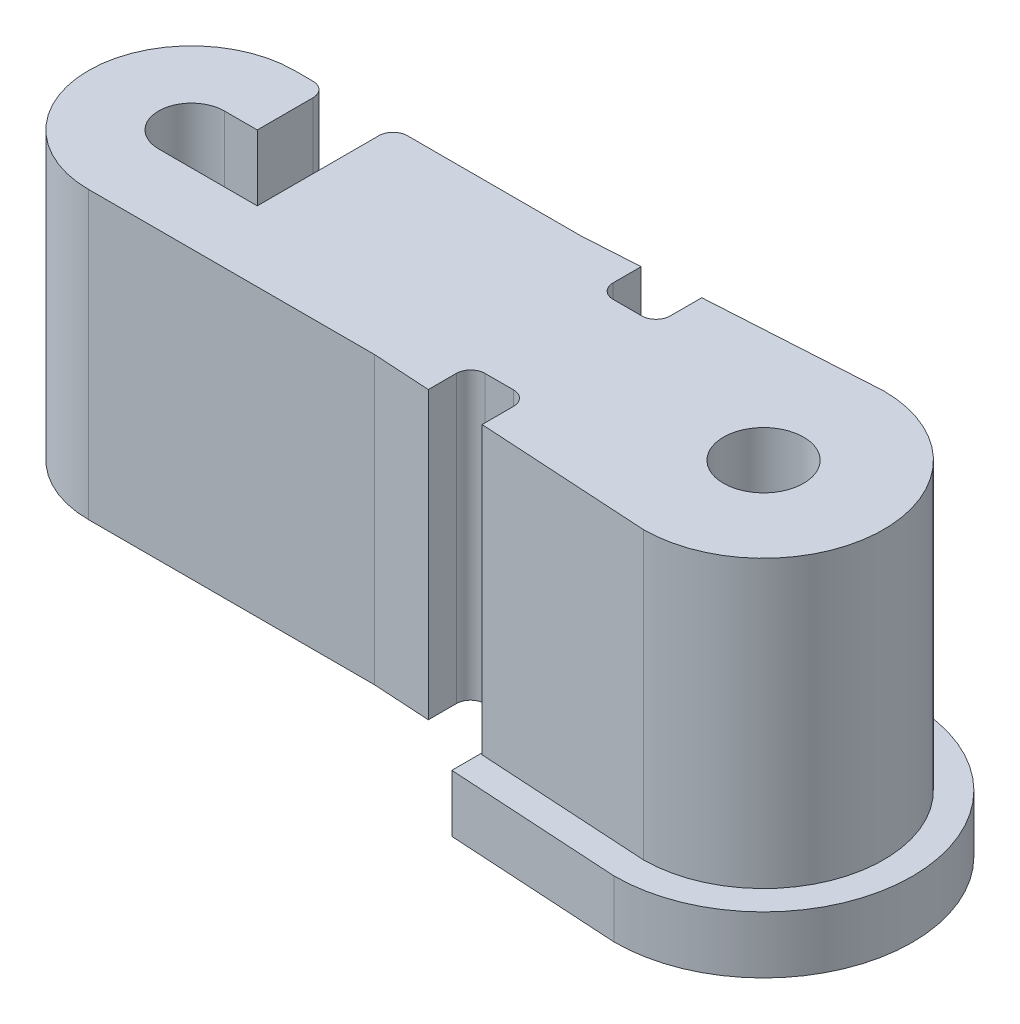
ISO-10303-21;
HEADER;
FILE_DESCRIPTION(('STEP AP214'),'2;1');
FILE_NAME('part.step','',(''),(''),'','','');
FILE_SCHEMA(('AUTOMOTIVE_DESIGN { 1 0 10303 214 1 1 1 1 }'));
ENDSEC;
DATA;
#1=APPLICATION_CONTEXT('core data for automotive mechanical design processes');
#2=APPLICATION_PROTOCOL_DEFINITION('international standard','automotive_design',2000,#1);
#3=PRODUCT_CONTEXT('',#1,'mechanical');
#4=PRODUCT('Part','Part','',(#3));
#5=PRODUCT_RELATED_PRODUCT_CATEGORY('part','',(#4));
#6=PRODUCT_DEFINITION_FORMATION('','',#4);
#7=PRODUCT_DEFINITION_CONTEXT('part definition',#1,'design');
#8=PRODUCT_DEFINITION('design','',#6,#7);
#9=PRODUCT_DEFINITION_SHAPE('','',#8);
#10=(LENGTH_UNIT() NAMED_UNIT(*) SI_UNIT(.MILLI.,.METRE.));
#11=(NAMED_UNIT(*) PLANE_ANGLE_UNIT() SI_UNIT($,.RADIAN.));
#12=(NAMED_UNIT(*) SI_UNIT($,.STERADIAN.) SOLID_ANGLE_UNIT());
#13=UNCERTAINTY_MEASURE_WITH_UNIT(LENGTH_MEASURE(1.E-05),#10,'distance_accuracy_value','');
#14=(GEOMETRIC_REPRESENTATION_CONTEXT(3) GLOBAL_UNCERTAINTY_ASSIGNED_CONTEXT((#13)) GLOBAL_UNIT_ASSIGNED_CONTEXT((#10,
#11,#12)) REPRESENTATION_CONTEXT('',''));
#15=CARTESIAN_POINT('',(0.,0.,0.));
#16=DIRECTION('',(0.,0.,1.));
#17=DIRECTION('',(1.,0.,0.));
#18=AXIS2_PLACEMENT_3D('',#15,#16,#17);
#19=CARTESIAN_POINT('',(0.,0.,0.));
#20=DIRECTION('',(0.,-1.,0.));
#21=DIRECTION('',(0.,0.,-1.));
#22=AXIS2_PLACEMENT_3D('',#19,#20,#21);
#23=PLANE('',#22);
#24=CARTESIAN_POINT('',(-1.625,0.,-0.685));
#25=DIRECTION('',(0.,-1.,0.));
#26=DIRECTION('',(0.,0.,-1.));
#27=AXIS2_PLACEMENT_3D('',#24,#25,#26);
#28=CIRCLE('',#27,0.125);
#29=CARTESIAN_POINT('',(-1.625,0.,-0.56));
#30=VERTEX_POINT('',#29);
#31=CARTESIAN_POINT('',(-1.51497307268199,0.,-0.625678205818127));
#32=VERTEX_POINT('',#31);
#33=EDGE_CURVE('E479',#30,#32,#28,.F.);
#34=ORIENTED_EDGE('',*,*,#33,.T.);
#35=DIRECTION('',(0.,0.,1.));
#36=VECTOR('',#35,1.);
#37=CARTESIAN_POINT('',(-1.51497307268199,0.,1.20955121136645));
#38=LINE('',#37,#36);
#39=CARTESIAN_POINT('',(-1.51497307268199,0.,0.625678205818127));
#40=VERTEX_POINT('',#39);
#41=EDGE_CURVE('E12',#32,#40,#38,.T.);
#42=ORIENTED_EDGE('',*,*,#41,.T.);
#43=CARTESIAN_POINT('',(-1.625,0.,0.685));
#44=DIRECTION('',(0.,-1.,0.));
#45=DIRECTION('',(0.,0.,-1.));
#46=AXIS2_PLACEMENT_3D('',#43,#44,#45);
#47=CIRCLE('',#46,0.125);
#48=CARTESIAN_POINT('',(-1.625,0.,0.56));
#49=VERTEX_POINT('',#48);
#50=EDGE_CURVE('E473',#40,#49,#47,.F.);
#51=ORIENTED_EDGE('',*,*,#50,.T.);
#52=DIRECTION('',(-1.,0.,0.));
#53=VECTOR('',#52,1.);
#54=CARTESIAN_POINT('',(-1.5,0.,0.56));
#55=LINE('',#54,#53);
#56=CARTESIAN_POINT('',(-1.875,0.,0.56));
#57=VERTEX_POINT('',#56);
#58=EDGE_CURVE('E390',#49,#57,#55,.T.);
#59=ORIENTED_EDGE('',*,*,#58,.T.);
#60=CARTESIAN_POINT('',(-1.875,0.,0.685));
#61=DIRECTION('',(0.,-1.,0.));
#62=DIRECTION('',(0.,0.,-1.));
#63=AXIS2_PLACEMENT_3D('',#60,#61,#62);
#64=CIRCLE('',#63,0.125);
#65=CARTESIAN_POINT('',(-2.,0.,0.685));
#66=VERTEX_POINT('',#65);
#67=EDGE_CURVE('E469',#57,#66,#64,.F.);
#68=ORIENTED_EDGE('',*,*,#67,.T.);
#69=DIRECTION('',(0.,0.,-1.));
#70=VECTOR('',#69,1.);
#71=CARTESIAN_POINT('',(-2.,0.,0.93));
#72=LINE('',#71,#70);
#73=CARTESIAN_POINT('',(-2.,0.,0.93));
#74=VERTEX_POINT('',#73);
#75=EDGE_CURVE('E393',#74,#66,#72,.T.);
#76=ORIENTED_EDGE('',*,*,#75,.F.);
#77=DIRECTION('',(0.998204845465779,0.,0.0598922907279451));
#78=VECTOR('',#77,1.);
#79=CARTESIAN_POINT('',(-2.50000000000002,0.,0.9));
#80=LINE('',#79,#78);
#81=CARTESIAN_POINT('',(-2.50000000000002,0.,0.9));
#82=VERTEX_POINT('',#81);
#83=EDGE_CURVE('E396',#82,#74,#80,.T.);
#84=ORIENTED_EDGE('',*,*,#83,.F.);
#85=DIRECTION('',(-1.,0.,0.));
#86=VECTOR('',#85,1.);
#87=CARTESIAN_POINT('',(-2.50000000000002,0.,0.9));
#88=LINE('',#87,#86);
#89=CARTESIAN_POINT('',(-5.,0.,0.9));
#90=VERTEX_POINT('',#89);
#91=EDGE_CURVE('E398',#82,#90,#88,.T.);
#92=ORIENTED_EDGE('',*,*,#91,.T.);
#93=CARTESIAN_POINT('',(-5.,0.,0.));
#94=DIRECTION('',(0.,1.,0.));
#95=DIRECTION('',(0.,0.,1.));
#96=AXIS2_PLACEMENT_3D('',#93,#94,#95);
#97=CIRCLE('',#96,0.9);
#98=CARTESIAN_POINT('',(-5.,0.,-0.9));
#99=VERTEX_POINT('',#98);
#100=EDGE_CURVE('E401',#99,#90,#97,.T.);
#101=ORIENTED_EDGE('',*,*,#100,.F.);
#102=DIRECTION('',(-1.,0.,0.));
#103=VECTOR('',#102,1.);
#104=CARTESIAN_POINT('',(-2.50000000000002,0.,-0.9));
#105=LINE('',#104,#103);
#106=CARTESIAN_POINT('',(-4.8375,0.,-0.9));
#107=VERTEX_POINT('',#106);
#108=EDGE_CURVE('E404',#107,#99,#105,.T.);
#109=ORIENTED_EDGE('',*,*,#108,.F.);
#110=CARTESIAN_POINT('',(-4.8375,0.,-0.775));
#111=DIRECTION('',(0.,-1.,0.));
#112=DIRECTION('',(0.,0.,-1.));
#113=AXIS2_PLACEMENT_3D('',#110,#111,#112);
#114=CIRCLE('',#113,0.125);
#115=CARTESIAN_POINT('',(-4.7125,0.,-0.775));
#116=VERTEX_POINT('',#115);
#117=EDGE_CURVE('E441',#107,#116,#114,.T.);
#118=ORIENTED_EDGE('',*,*,#117,.T.);
#119=DIRECTION('',(0.,0.,1.));
#120=VECTOR('',#119,1.);
#121=CARTESIAN_POINT('',(-4.7125,0.,0.));
#122=LINE('',#121,#120);
#123=CARTESIAN_POINT('',(-4.7125,0.,-0.2875));
#124=VERTEX_POINT('',#123);
#125=EDGE_CURVE('E298',#116,#124,#122,.T.);
#126=ORIENTED_EDGE('',*,*,#125,.T.);
#127=DIRECTION('',(1.,0.,0.));
#128=VECTOR('',#127,1.);
#129=CARTESIAN_POINT('',(0.,0.,-0.2875));
#130=LINE('',#129,#128);
#131=CARTESIAN_POINT('',(-5.,0.,-0.2875));
#132=VERTEX_POINT('',#131);
#133=EDGE_CURVE('E286',#132,#124,#130,.T.);
#134=ORIENTED_EDGE('',*,*,#133,.F.);
#135=CARTESIAN_POINT('',(-5.,0.,0.));
#136=DIRECTION('',(0.,1.,0.));
#137=DIRECTION('',(0.,0.,1.));
#138=AXIS2_PLACEMENT_3D('',#135,#136,#137);
#139=CIRCLE('',#138,0.2875);
#140=CARTESIAN_POINT('',(-5.,0.,0.2875));
#141=VERTEX_POINT('',#140);
#142=EDGE_CURVE('E289',#132,#141,#139,.T.);
#143=ORIENTED_EDGE('',*,*,#142,.T.);
#144=DIRECTION('',(-1.,0.,0.));
#145=VECTOR('',#144,1.);
#146=CARTESIAN_POINT('',(0.,0.,0.287499999999999));
#147=LINE('',#146,#145);
#148=CARTESIAN_POINT('',(-4.1375,0.,0.2875));
#149=VERTEX_POINT('',#148);
#150=EDGE_CURVE('E293',#149,#141,#147,.T.);
#151=ORIENTED_EDGE('',*,*,#150,.F.);
#152=DIRECTION('',(0.,0.,1.));
#153=VECTOR('',#152,1.);
#154=CARTESIAN_POINT('',(-4.1375,0.,0.));
#155=LINE('',#154,#153);
#156=CARTESIAN_POINT('',(-4.1375,0.,-0.775));
#157=VERTEX_POINT('',#156);
#158=EDGE_CURVE('E296',#157,#149,#155,.T.);
#159=ORIENTED_EDGE('',*,*,#158,.F.);
#160=CARTESIAN_POINT('',(-4.0125,0.,-0.775));
#161=DIRECTION('',(0.,-1.,0.));
#162=DIRECTION('',(0.,0.,-1.));
#163=AXIS2_PLACEMENT_3D('',#160,#161,#162);
#164=CIRCLE('',#163,0.125);
#165=CARTESIAN_POINT('',(-4.0125,0.,-0.9));
#166=VERTEX_POINT('',#165);
#167=EDGE_CURVE('E443',#157,#166,#164,.T.);
#168=ORIENTED_EDGE('',*,*,#167,.T.);
#169=CARTESIAN_POINT('',(-2.50000000000002,0.,-0.9));
#170=VERTEX_POINT('',#169);
#171=EDGE_CURVE('E332',#170,#166,#105,.T.);
#172=ORIENTED_EDGE('',*,*,#171,.F.);
#173=DIRECTION('',(0.998204845465779,0.,-0.0598922907279451));
#174=VECTOR('',#173,1.);
#175=CARTESIAN_POINT('',(-2.50000000000002,0.,-0.9));
#176=LINE('',#175,#174);
#177=CARTESIAN_POINT('',(-2.,0.,-0.93));
#178=VERTEX_POINT('',#177);
#179=EDGE_CURVE('E317',#170,#178,#176,.T.);
#180=ORIENTED_EDGE('',*,*,#179,.T.);
#181=DIRECTION('',(0.,0.,1.));
#182=VECTOR('',#181,1.);
#183=CARTESIAN_POINT('',(-2.,0.,-0.93));
#184=LINE('',#183,#182);
#185=CARTESIAN_POINT('',(-2.,0.,-0.685));
#186=VERTEX_POINT('',#185);
#187=EDGE_CURVE('E372',#178,#186,#184,.T.);
#188=ORIENTED_EDGE('',*,*,#187,.T.);
#189=CARTESIAN_POINT('',(-1.875,0.,-0.685));
#190=DIRECTION('',(0.,-1.,0.));
#191=DIRECTION('',(0.,0.,-1.));
#192=AXIS2_PLACEMENT_3D('',#189,#190,#191);
#193=CIRCLE('',#192,0.125);
#194=CARTESIAN_POINT('',(-1.875,0.,-0.56));
#195=VERTEX_POINT('',#194);
#196=EDGE_CURVE('E483',#186,#195,#193,.F.);
#197=ORIENTED_EDGE('',*,*,#196,.T.);
#198=DIRECTION('',(1.,0.,0.));
#199=VECTOR('',#198,1.);
#200=CARTESIAN_POINT('',(-2.,0.,-0.56));
#201=LINE('',#200,#199);
#202=EDGE_CURVE('E375',#195,#30,#201,.T.);
#203=ORIENTED_EDGE('',*,*,#202,.T.);
#204=EDGE_LOOP('',(#34,#42,#51,#59,#68,#76,#84,#92,#101,#109,#118,#126,#134,#143,#151,#159,#168,
#172,#180,#188,#197,#203));
#205=FACE_BOUND('',#204,.T.);
#206=ADVANCED_FACE('F36',(#205),#23,.T.);
#207=CARTESIAN_POINT('',(-2.50000000000002,2.5,-0.9));
#208=DIRECTION('',(0.,0.,1.));
#209=DIRECTION('',(1.,0.,0.));
#210=AXIS2_PLACEMENT_3D('',#207,#208,#209);
#211=PLANE('',#210);
#212=ORIENTED_EDGE('',*,*,#171,.T.);
#213=DIRECTION('',(0.,1.,0.));
#214=VECTOR('',#213,1.);
#215=CARTESIAN_POINT('',(-4.0125,2.5,-0.9));
#216=LINE('',#215,#214);
#217=CARTESIAN_POINT('',(-4.0125,2.5,-0.9));
#218=VERTEX_POINT('',#217);
#219=EDGE_CURVE('E409',#166,#218,#216,.T.);
#220=ORIENTED_EDGE('',*,*,#219,.T.);
#221=DIRECTION('',(-1.,0.,0.));
#222=VECTOR('',#221,1.);
#223=CARTESIAN_POINT('',(-2.50000000000002,2.5,-0.9));
#224=LINE('',#223,#222);
#225=CARTESIAN_POINT('',(-2.50000000000002,2.5,-0.9));
#226=VERTEX_POINT('',#225);
#227=EDGE_CURVE('E366',#226,#218,#224,.T.);
#228=ORIENTED_EDGE('',*,*,#227,.F.);
#229=DIRECTION('',(0.,-1.,0.));
#230=VECTOR('',#229,1.);
#231=CARTESIAN_POINT('',(-2.50000000000002,2.5,-0.9));
#232=LINE('',#231,#230);
#233=EDGE_CURVE('E407',#226,#170,#232,.T.);
#234=ORIENTED_EDGE('',*,*,#233,.T.);
#235=EDGE_LOOP('',(#212,#220,#228,#234));
#236=FACE_BOUND('',#235,.T.);
#237=ADVANCED_FACE('F597',(#236),#211,.F.);
#238=CARTESIAN_POINT('',(-2.50000000000002,2.5,-0.9));
#239=DIRECTION('',(-0.0598922907279451,0.,-0.998204845465779));
#240=DIRECTION('',(-0.998204845465779,0.,0.0598922907279451));
#241=AXIS2_PLACEMENT_3D('',#238,#239,#240);
#242=PLANE('',#241);
#243=ORIENTED_EDGE('',*,*,#179,.F.);
#244=ORIENTED_EDGE('',*,*,#233,.F.);
#245=DIRECTION('',(0.998204845465779,0.,-0.0598922907279451));
#246=VECTOR('',#245,1.);
#247=CARTESIAN_POINT('',(-2.50000000000002,2.5,-0.9));
#248=LINE('',#247,#246);
#249=CARTESIAN_POINT('',(-2.,2.5,-0.93));
#250=VERTEX_POINT('',#249);
#251=EDGE_CURVE('E328',#226,#250,#248,.T.);
#252=ORIENTED_EDGE('',*,*,#251,.T.);
#253=DIRECTION('',(0.,-1.,0.));
#254=VECTOR('',#253,1.);
#255=CARTESIAN_POINT('',(-2.,2.5,-0.93));
#256=LINE('',#255,#254);
#257=EDGE_CURVE('E369',#250,#178,#256,.T.);
#258=ORIENTED_EDGE('',*,*,#257,.T.);
#259=EDGE_LOOP('',(#243,#244,#252,#258));
#260=FACE_BOUND('',#259,.T.);
#261=ADVANCED_FACE('F600',(#260),#242,.T.);
#262=CARTESIAN_POINT('',(-4.8375,2.5,-0.9));
#263=VERTEX_POINT('',#262);
#264=CARTESIAN_POINT('',(-5.,2.5,-0.9));
#265=VERTEX_POINT('',#264);
#266=EDGE_CURVE('E365',#263,#265,#224,.T.);
#267=ORIENTED_EDGE('',*,*,#266,.F.);
#268=DIRECTION('',(0.,1.,0.));
#269=VECTOR('',#268,1.);
#270=CARTESIAN_POINT('',(-4.8375,2.5,-0.9));
#271=LINE('',#270,#269);
#272=EDGE_CURVE('E61',#263,#107,#271,.F.);
#273=ORIENTED_EDGE('',*,*,#272,.T.);
#274=ORIENTED_EDGE('',*,*,#108,.T.);
#275=DIRECTION('',(0.,-1.,0.));
#276=VECTOR('',#275,1.);
#277=CARTESIAN_POINT('',(-5.,2.5,-0.9));
#278=LINE('',#277,#276);
#279=EDGE_CURVE('E410',#265,#99,#278,.T.);
#280=ORIENTED_EDGE('',*,*,#279,.F.);
#281=EDGE_LOOP('',(#267,#273,#274,#280));
#282=FACE_BOUND('',#281,.T.);
#283=ADVANCED_FACE('F602',(#282),#211,.F.);
#284=CARTESIAN_POINT('',(-5.,2.5,0.));
#285=DIRECTION('',(0.,-1.,0.));
#286=DIRECTION('',(0.,0.,-1.));
#287=AXIS2_PLACEMENT_3D('',#284,#285,#286);
#288=CYLINDRICAL_SURFACE('',#287,0.9);
#289=ORIENTED_EDGE('',*,*,#100,.T.);
#290=DIRECTION('',(0.,-1.,0.));
#291=VECTOR('',#290,1.);
#292=CARTESIAN_POINT('',(-5.,2.5,0.9));
#293=LINE('',#292,#291);
#294=CARTESIAN_POINT('',(-5.,2.5,0.9));
#295=VERTEX_POINT('',#294);
#296=EDGE_CURVE('E413',#295,#90,#293,.T.);
#297=ORIENTED_EDGE('',*,*,#296,.F.);
#298=CARTESIAN_POINT('',(-5.,2.5,0.));
#299=DIRECTION('',(0.,1.,0.));
#300=DIRECTION('',(0.,0.,1.));
#301=AXIS2_PLACEMENT_3D('',#298,#299,#300);
#302=CIRCLE('',#301,0.9);
#303=EDGE_CURVE('E363',#265,#295,#302,.T.);
#304=ORIENTED_EDGE('',*,*,#303,.F.);
#305=ORIENTED_EDGE('',*,*,#279,.T.);
#306=EDGE_LOOP('',(#289,#297,#304,#305));
#307=FACE_BOUND('',#306,.T.);
#308=ADVANCED_FACE('F561',(#307),#288,.T.);
#309=CARTESIAN_POINT('',(-2.50000000000002,2.5,0.9));
#310=DIRECTION('',(0.,0.,1.));
#311=DIRECTION('',(1.,0.,0.));
#312=AXIS2_PLACEMENT_3D('',#309,#310,#311);
#313=PLANE('',#312);
#314=ORIENTED_EDGE('',*,*,#91,.F.);
#315=DIRECTION('',(0.,-1.,0.));
#316=VECTOR('',#315,1.);
#317=CARTESIAN_POINT('',(-2.50000000000002,2.5,0.9));
#318=LINE('',#317,#316);
#319=CARTESIAN_POINT('',(-2.50000000000002,2.5,0.9));
#320=VERTEX_POINT('',#319);
#321=EDGE_CURVE('E415',#320,#82,#318,.T.);
#322=ORIENTED_EDGE('',*,*,#321,.F.);
#323=DIRECTION('',(-1.,0.,0.));
#324=VECTOR('',#323,1.);
#325=CARTESIAN_POINT('',(-2.50000000000002,2.5,0.9));
#326=LINE('',#325,#324);
#327=EDGE_CURVE('E360',#320,#295,#326,.T.);
#328=ORIENTED_EDGE('',*,*,#327,.T.);
#329=ORIENTED_EDGE('',*,*,#296,.T.);
#330=EDGE_LOOP('',(#314,#322,#328,#329));
#331=FACE_BOUND('',#330,.T.);
#332=ADVANCED_FACE('F557',(#331),#313,.T.);
#333=CARTESIAN_POINT('',(-2.50000000000002,2.5,0.9));
#334=DIRECTION('',(0.0598922907279451,0.,-0.998204845465779));
#335=DIRECTION('',(-0.998204845465779,0.,-0.0598922907279451));
#336=AXIS2_PLACEMENT_3D('',#333,#334,#335);
#337=PLANE('',#336);
#338=ORIENTED_EDGE('',*,*,#83,.T.);
#339=DIRECTION('',(0.,-1.,0.));
#340=VECTOR('',#339,1.);
#341=CARTESIAN_POINT('',(-2.,2.5,0.93));
#342=LINE('',#341,#340);
#343=CARTESIAN_POINT('',(-2.,2.5,0.93));
#344=VERTEX_POINT('',#343);
#345=EDGE_CURVE('E417',#344,#74,#342,.T.);
#346=ORIENTED_EDGE('',*,*,#345,.F.);
#347=DIRECTION('',(0.998204845465779,0.,0.0598922907279451));
#348=VECTOR('',#347,1.);
#349=CARTESIAN_POINT('',(-2.50000000000002,2.5,0.9));
#350=LINE('',#349,#348);
#351=EDGE_CURVE('E358',#320,#344,#350,.T.);
#352=ORIENTED_EDGE('',*,*,#351,.F.);
#353=ORIENTED_EDGE('',*,*,#321,.T.);
#354=EDGE_LOOP('',(#338,#346,#352,#353));
#355=FACE_BOUND('',#354,.T.);
#356=ADVANCED_FACE('F552',(#355),#337,.F.);
#357=CARTESIAN_POINT('',(-2.,2.5,0.93));
#358=DIRECTION('',(-1.,0.,0.));
#359=DIRECTION('',(0.,0.,1.));
#360=AXIS2_PLACEMENT_3D('',#357,#358,#359);
#361=PLANE('',#360);
#362=ORIENTED_EDGE('',*,*,#75,.T.);
#363=DIRECTION('',(0.,-1.,0.));
#364=VECTOR('',#363,1.);
#365=CARTESIAN_POINT('',(-2.,2.5,0.685));
#366=LINE('',#365,#364);
#367=CARTESIAN_POINT('',(-2.,2.5,0.685));
#368=VERTEX_POINT('',#367);
#369=EDGE_CURVE('E454',#66,#368,#366,.F.);
#370=ORIENTED_EDGE('',*,*,#369,.T.);
#371=DIRECTION('',(0.,0.,-1.));
#372=VECTOR('',#371,1.);
#373=CARTESIAN_POINT('',(-2.,2.5,0.93));
#374=LINE('',#373,#372);
#375=EDGE_CURVE('E355',#344,#368,#374,.T.);
#376=ORIENTED_EDGE('',*,*,#375,.F.);
#377=ORIENTED_EDGE('',*,*,#345,.T.);
#378=EDGE_LOOP('',(#362,#370,#376,#377));
#379=FACE_BOUND('',#378,.T.);
#380=ADVANCED_FACE('F547',(#379),#361,.F.);
#381=CARTESIAN_POINT('',(-1.5,2.5,0.56));
#382=DIRECTION('',(0.,0.,1.));
#383=DIRECTION('',(1.,0.,0.));
#384=AXIS2_PLACEMENT_3D('',#381,#382,#383);
#385=PLANE('',#384);
#386=DIRECTION('',(-1.,0.,0.));
#387=VECTOR('',#386,1.);
#388=CARTESIAN_POINT('',(-1.5,2.5,0.56));
#389=LINE('',#388,#387);
#390=CARTESIAN_POINT('',(-1.625,2.5,0.56));
#391=VERTEX_POINT('',#390);
#392=CARTESIAN_POINT('',(-1.875,2.5,0.56));
#393=VERTEX_POINT('',#392);
#394=EDGE_CURVE('E352',#391,#393,#389,.T.);
#395=ORIENTED_EDGE('',*,*,#394,.T.);
#396=DIRECTION('',(0.,-1.,0.));
#397=VECTOR('',#396,1.);
#398=CARTESIAN_POINT('',(-1.875,2.5,0.56));
#399=LINE('',#398,#397);
#400=EDGE_CURVE('E451',#393,#57,#399,.T.);
#401=ORIENTED_EDGE('',*,*,#400,.T.);
#402=ORIENTED_EDGE('',*,*,#58,.F.);
#403=DIRECTION('',(0.,-1.,0.));
#404=VECTOR('',#403,1.);
#405=CARTESIAN_POINT('',(-1.625,2.5,0.56));
#406=LINE('',#405,#404);
#407=EDGE_CURVE('E449',#49,#391,#406,.F.);
#408=ORIENTED_EDGE('',*,*,#407,.T.);
#409=EDGE_LOOP('',(#395,#401,#402,#408));
#410=FACE_BOUND('',#409,.T.);
#411=ADVANCED_FACE('F537',(#410),#385,.T.);
#412=CARTESIAN_POINT('',(-1.5,2.5,0.56));
#413=DIRECTION('',(1.,0.,0.));
#414=DIRECTION('',(0.,0.,-1.));
#415=AXIS2_PLACEMENT_3D('',#412,#413,#414);
#416=PLANE('',#415);
#417=DIRECTION('',(0.,0.,1.));
#418=VECTOR('',#417,1.);
#419=CARTESIAN_POINT('',(-1.5,2.5,0.56));
#420=LINE('',#419,#418);
#421=CARTESIAN_POINT('',(-1.5,2.5,0.685));
#422=VERTEX_POINT('',#421);
#423=CARTESIAN_POINT('',(-1.5,2.5,0.96));
#424=VERTEX_POINT('',#423);
#425=EDGE_CURVE('E350',#422,#424,#420,.T.);
#426=ORIENTED_EDGE('',*,*,#425,.F.);
#427=DIRECTION('',(0.,-1.,0.));
#428=VECTOR('',#427,1.);
#429=CARTESIAN_POINT('',(-1.5,2.5,0.685));
#430=LINE('',#429,#428);
#431=CARTESIAN_POINT('',(-1.5,0.,0.685));
#432=VERTEX_POINT('',#431);
#433=EDGE_CURVE('E456',#422,#432,#430,.T.);
#434=ORIENTED_EDGE('',*,*,#433,.T.);
#435=DIRECTION('',(0.,0.,1.));
#436=VECTOR('',#435,1.);
#437=CARTESIAN_POINT('',(-1.5,0.,0.56));
#438=LINE('',#437,#436);
#439=CARTESIAN_POINT('',(-1.5,0.,0.96));
#440=VERTEX_POINT('',#439);
#441=EDGE_CURVE('E387',#432,#440,#438,.T.);
#442=ORIENTED_EDGE('',*,*,#441,.T.);
#443=DIRECTION('',(0.,-1.,0.));
#444=VECTOR('',#443,1.);
#445=CARTESIAN_POINT('',(-1.5,2.5,0.96));
#446=LINE('',#445,#444);
#447=EDGE_CURVE('E420',#424,#440,#446,.T.);
#448=ORIENTED_EDGE('',*,*,#447,.F.);
#449=EDGE_LOOP('',(#426,#434,#442,#448));
#450=FACE_BOUND('',#449,.T.);
#451=ADVANCED_FACE('F528',(#450),#416,.F.);
#452=CARTESIAN_POINT('',(0.,2.5,1.05));
#453=DIRECTION('',(-0.0598922907279466,0.,0.998204845465779));
#454=DIRECTION('',(0.998204845465779,0.,0.0598922907279466));
#455=AXIS2_PLACEMENT_3D('',#452,#453,#454);
#456=PLANE('',#455);
#457=DIRECTION('',(-0.998204845465779,0.,-0.0598922907279466));
#458=VECTOR('',#457,1.);
#459=CARTESIAN_POINT('',(0.,0.,1.05));
#460=LINE('',#459,#458);
#461=CARTESIAN_POINT('',(0.,0.,1.05));
#462=VERTEX_POINT('',#461);
#463=EDGE_CURVE('E385',#462,#440,#460,.T.);
#464=ORIENTED_EDGE('',*,*,#463,.F.);
#465=DIRECTION('',(0.,-1.,0.));
#466=VECTOR('',#465,1.);
#467=CARTESIAN_POINT('',(0.,2.5,1.05));
#468=LINE('',#467,#466);
#469=CARTESIAN_POINT('',(0.,2.5,1.05));
#470=VERTEX_POINT('',#469);
#471=EDGE_CURVE('E423',#470,#462,#468,.T.);
#472=ORIENTED_EDGE('',*,*,#471,.F.);
#473=DIRECTION('',(-0.998204845465779,0.,-0.0598922907279466));
#474=VECTOR('',#473,1.);
#475=CARTESIAN_POINT('',(0.,2.5,1.05));
#476=LINE('',#475,#474);
#477=EDGE_CURVE('E347',#470,#424,#476,.T.);
#478=ORIENTED_EDGE('',*,*,#477,.T.);
#479=ORIENTED_EDGE('',*,*,#447,.T.);
#480=EDGE_LOOP('',(#464,#472,#478,#479));
#481=FACE_BOUND('',#480,.T.);
#482=ADVANCED_FACE('F524',(#481),#456,.T.);
#483=CARTESIAN_POINT('',(0.,2.5,0.));
#484=DIRECTION('',(0.,-1.,0.));
#485=DIRECTION('',(0.,0.,-1.));
#486=AXIS2_PLACEMENT_3D('',#483,#484,#485);
#487=CYLINDRICAL_SURFACE('',#486,1.05);
#488=CARTESIAN_POINT('',(0.,0.,0.));
#489=DIRECTION('',(0.,-1.,0.));
#490=DIRECTION('',(0.,0.,-1.));
#491=AXIS2_PLACEMENT_3D('',#488,#489,#490);
#492=CIRCLE('',#491,1.05);
#493=CARTESIAN_POINT('',(0.,0.,-1.05));
#494=VERTEX_POINT('',#493);
#495=EDGE_CURVE('E383',#494,#462,#492,.T.);
#496=ORIENTED_EDGE('',*,*,#495,.F.);
#497=DIRECTION('',(0.,-1.,0.));
#498=VECTOR('',#497,1.);
#499=CARTESIAN_POINT('',(0.,2.5,-1.05));
#500=LINE('',#499,#498);
#501=CARTESIAN_POINT('',(0.,2.5,-1.05));
#502=VERTEX_POINT('',#501);
#503=EDGE_CURVE('E426',#502,#494,#500,.T.);
#504=ORIENTED_EDGE('',*,*,#503,.F.);
#505=CARTESIAN_POINT('',(0.,2.5,0.));
#506=DIRECTION('',(0.,-1.,0.));
#507=DIRECTION('',(0.,0.,-1.));
#508=AXIS2_PLACEMENT_3D('',#505,#506,#507);
#509=CIRCLE('',#508,1.05);
#510=EDGE_CURVE('E344',#502,#470,#509,.T.);
#511=ORIENTED_EDGE('',*,*,#510,.T.);
#512=ORIENTED_EDGE('',*,*,#471,.T.);
#513=EDGE_LOOP('',(#496,#504,#511,#512));
#514=FACE_BOUND('',#513,.T.);
#515=ADVANCED_FACE('F520',(#514),#487,.T.);
#516=CARTESIAN_POINT('',(-1.5,2.5,-0.96));
#517=DIRECTION('',(-0.0598922907279466,0.,-0.998204845465779));
#518=DIRECTION('',(-0.998204845465779,0.,0.0598922907279466));
#519=AXIS2_PLACEMENT_3D('',#516,#517,#518);
#520=PLANE('',#519);
#521=DIRECTION('',(0.998204845465779,0.,-0.0598922907279466));
#522=VECTOR('',#521,1.);
#523=CARTESIAN_POINT('',(-1.5,0.,-0.96));
#524=LINE('',#523,#522);
#525=CARTESIAN_POINT('',(-1.5,0.,-0.96));
#526=VERTEX_POINT('',#525);
#527=EDGE_CURVE('E381',#526,#494,#524,.T.);
#528=ORIENTED_EDGE('',*,*,#527,.F.);
#529=DIRECTION('',(0.,-1.,0.));
#530=VECTOR('',#529,1.);
#531=CARTESIAN_POINT('',(-1.5,2.5,-0.96));
#532=LINE('',#531,#530);
#533=CARTESIAN_POINT('',(-1.5,2.5,-0.96));
#534=VERTEX_POINT('',#533);
#535=EDGE_CURVE('E429',#534,#526,#532,.T.);
#536=ORIENTED_EDGE('',*,*,#535,.F.);
#537=DIRECTION('',(0.998204845465779,0.,-0.0598922907279466));
#538=VECTOR('',#537,1.);
#539=CARTESIAN_POINT('',(-1.5,2.5,-0.96));
#540=LINE('',#539,#538);
#541=EDGE_CURVE('E341',#534,#502,#540,.T.);
#542=ORIENTED_EDGE('',*,*,#541,.T.);
#543=ORIENTED_EDGE('',*,*,#503,.T.);
#544=EDGE_LOOP('',(#528,#536,#542,#543));
#545=FACE_BOUND('',#544,.T.);
#546=ADVANCED_FACE('F516',(#545),#520,.T.);
#547=CARTESIAN_POINT('',(-1.5,2.5,-0.96));
#548=DIRECTION('',(1.,0.,0.));
#549=DIRECTION('',(0.,0.,-1.));
#550=AXIS2_PLACEMENT_3D('',#547,#548,#549);
#551=PLANE('',#550);
#552=DIRECTION('',(0.,0.,1.));
#553=VECTOR('',#552,1.);
#554=CARTESIAN_POINT('',(-1.5,0.,-0.96));
#555=LINE('',#554,#553);
#556=CARTESIAN_POINT('',(-1.5,0.,-0.685));
#557=VERTEX_POINT('',#556);
#558=EDGE_CURVE('E378',#526,#557,#555,.T.);
#559=ORIENTED_EDGE('',*,*,#558,.T.);
#560=DIRECTION('',(0.,-1.,0.));
#561=VECTOR('',#560,1.);
#562=CARTESIAN_POINT('',(-1.5,2.5,-0.685));
#563=LINE('',#562,#561);
#564=CARTESIAN_POINT('',(-1.5,2.5,-0.685));
#565=VERTEX_POINT('',#564);
#566=EDGE_CURVE('E464',#557,#565,#563,.F.);
#567=ORIENTED_EDGE('',*,*,#566,.T.);
#568=DIRECTION('',(0.,0.,1.));
#569=VECTOR('',#568,1.);
#570=CARTESIAN_POINT('',(-1.5,2.5,-0.96));
#571=LINE('',#570,#569);
#572=EDGE_CURVE('E338',#534,#565,#571,.T.);
#573=ORIENTED_EDGE('',*,*,#572,.F.);
#574=ORIENTED_EDGE('',*,*,#535,.T.);
#575=EDGE_LOOP('',(#559,#567,#573,#574));
#576=FACE_BOUND('',#575,.T.);
#577=ADVANCED_FACE('F511',(#576),#551,.F.);
#578=CARTESIAN_POINT('',(-2.,2.5,-0.56));
#579=DIRECTION('',(0.,0.,-1.));
#580=DIRECTION('',(-1.,0.,0.));
#581=AXIS2_PLACEMENT_3D('',#578,#579,#580);
#582=PLANE('',#581);
#583=DIRECTION('',(1.,0.,0.));
#584=VECTOR('',#583,1.);
#585=CARTESIAN_POINT('',(-2.,2.5,-0.56));
#586=LINE('',#585,#584);
#587=CARTESIAN_POINT('',(-1.875,2.5,-0.56));
#588=VERTEX_POINT('',#587);
#589=CARTESIAN_POINT('',(-1.625,2.5,-0.56));
#590=VERTEX_POINT('',#589);
#591=EDGE_CURVE('E335',#588,#590,#586,.T.);
#592=ORIENTED_EDGE('',*,*,#591,.T.);
#593=DIRECTION('',(0.,-1.,0.));
#594=VECTOR('',#593,1.);
#595=CARTESIAN_POINT('',(-1.625,2.5,-0.56));
#596=LINE('',#595,#594);
#597=EDGE_CURVE('E461',#590,#30,#596,.T.);
#598=ORIENTED_EDGE('',*,*,#597,.T.);
#599=ORIENTED_EDGE('',*,*,#202,.F.);
#600=DIRECTION('',(0.,-1.,0.));
#601=VECTOR('',#600,1.);
#602=CARTESIAN_POINT('',(-1.875,2.5,-0.56));
#603=LINE('',#602,#601);
#604=EDGE_CURVE('E459',#195,#588,#603,.F.);
#605=ORIENTED_EDGE('',*,*,#604,.T.);
#606=EDGE_LOOP('',(#592,#598,#599,#605));
#607=FACE_BOUND('',#606,.T.);
#608=ADVANCED_FACE('F500',(#607),#582,.T.);
#609=CARTESIAN_POINT('',(-2.,2.5,-0.93));
#610=DIRECTION('',(1.,0.,0.));
#611=DIRECTION('',(0.,0.,-1.));
#612=AXIS2_PLACEMENT_3D('',#609,#610,#611);
#613=PLANE('',#612);
#614=DIRECTION('',(0.,0.,1.));
#615=VECTOR('',#614,1.);
#616=CARTESIAN_POINT('',(-2.,2.5,-0.93));
#617=LINE('',#616,#615);
#618=CARTESIAN_POINT('',(-2.,2.5,-0.685));
#619=VERTEX_POINT('',#618);
#620=EDGE_CURVE('E331',#250,#619,#617,.T.);
#621=ORIENTED_EDGE('',*,*,#620,.T.);
#622=DIRECTION('',(0.,-1.,0.));
#623=VECTOR('',#622,1.);
#624=CARTESIAN_POINT('',(-2.,0.,-0.685));
#625=LINE('',#624,#623);
#626=EDGE_CURVE('E466',#619,#186,#625,.T.);
#627=ORIENTED_EDGE('',*,*,#626,.T.);
#628=ORIENTED_EDGE('',*,*,#187,.F.);
#629=ORIENTED_EDGE('',*,*,#257,.F.);
#630=EDGE_LOOP('',(#621,#627,#628,#629));
#631=FACE_BOUND('',#630,.T.);
#632=ADVANCED_FACE('F497',(#631),#613,.T.);
#633=CARTESIAN_POINT('',(0.,2.5,0.));
#634=DIRECTION('',(0.,-1.,0.));
#635=DIRECTION('',(0.,0.,-1.));
#636=AXIS2_PLACEMENT_3D('',#633,#634,#635);
#637=PLANE('',#636);
#638=ORIENTED_EDGE('',*,*,#227,.T.);
#639=CARTESIAN_POINT('',(-4.0125,2.5,-0.775));
#640=DIRECTION('',(0.,-1.,0.));
#641=DIRECTION('',(0.,0.,-1.));
#642=AXIS2_PLACEMENT_3D('',#639,#640,#641);
#643=CIRCLE('',#642,0.125);
#644=CARTESIAN_POINT('',(-4.1375,2.5,-0.775));
#645=VERTEX_POINT('',#644);
#646=EDGE_CURVE('E437',#218,#645,#643,.F.);
#647=ORIENTED_EDGE('',*,*,#646,.T.);
#648=DIRECTION('',(0.,0.,1.));
#649=VECTOR('',#648,1.);
#650=CARTESIAN_POINT('',(-4.1375,2.5,0.));
#651=LINE('',#650,#649);
#652=CARTESIAN_POINT('',(-4.1375,2.5,0.2875));
#653=VERTEX_POINT('',#652);
#654=EDGE_CURVE('E311',#645,#653,#651,.T.);
#655=ORIENTED_EDGE('',*,*,#654,.T.);
#656=DIRECTION('',(-1.,0.,0.));
#657=VECTOR('',#656,1.);
#658=CARTESIAN_POINT('',(0.,2.5,0.287499999999999));
#659=LINE('',#658,#657);
#660=CARTESIAN_POINT('',(-5.,2.5,0.2875));
#661=VERTEX_POINT('',#660);
#662=EDGE_CURVE('E308',#653,#661,#659,.T.);
#663=ORIENTED_EDGE('',*,*,#662,.T.);
#664=CARTESIAN_POINT('',(-5.,2.5,0.));
#665=DIRECTION('',(0.,1.,0.));
#666=DIRECTION('',(0.,0.,1.));
#667=AXIS2_PLACEMENT_3D('',#664,#665,#666);
#668=CIRCLE('',#667,0.2875);
#669=CARTESIAN_POINT('',(-5.,2.5,-0.2875));
#670=VERTEX_POINT('',#669);
#671=EDGE_CURVE('E304',#670,#661,#668,.T.);
#672=ORIENTED_EDGE('',*,*,#671,.F.);
#673=DIRECTION('',(1.,0.,0.));
#674=VECTOR('',#673,1.);
#675=CARTESIAN_POINT('',(0.,2.5,-0.2875));
#676=LINE('',#675,#674);
#677=CARTESIAN_POINT('',(-4.7125,2.5,-0.2875));
#678=VERTEX_POINT('',#677);
#679=EDGE_CURVE('E301',#670,#678,#676,.T.);
#680=ORIENTED_EDGE('',*,*,#679,.T.);
#681=DIRECTION('',(0.,0.,1.));
#682=VECTOR('',#681,1.);
#683=CARTESIAN_POINT('',(-4.7125,2.5,0.));
#684=LINE('',#683,#682);
#685=CARTESIAN_POINT('',(-4.7125,2.5,-0.775));
#686=VERTEX_POINT('',#685);
#687=EDGE_CURVE('E290',#686,#678,#684,.T.);
#688=ORIENTED_EDGE('',*,*,#687,.F.);
#689=CARTESIAN_POINT('',(-4.8375,2.5,-0.775));
#690=DIRECTION('',(0.,-1.,0.));
#691=DIRECTION('',(0.,0.,-1.));
#692=AXIS2_PLACEMENT_3D('',#689,#690,#691);
#693=CIRCLE('',#692,0.125);
#694=EDGE_CURVE('E435',#686,#263,#693,.F.);
#695=ORIENTED_EDGE('',*,*,#694,.T.);
#696=ORIENTED_EDGE('',*,*,#266,.T.);
#697=ORIENTED_EDGE('',*,*,#303,.T.);
#698=ORIENTED_EDGE('',*,*,#327,.F.);
#699=ORIENTED_EDGE('',*,*,#351,.T.);
#700=ORIENTED_EDGE('',*,*,#375,.T.);
#701=CARTESIAN_POINT('',(-1.875,2.5,0.685));
#702=DIRECTION('',(0.,-1.,0.));
#703=DIRECTION('',(0.,0.,-1.));
#704=AXIS2_PLACEMENT_3D('',#701,#702,#703);
#705=CIRCLE('',#704,0.125);
#706=EDGE_CURVE('E471',#368,#393,#705,.T.);
#707=ORIENTED_EDGE('',*,*,#706,.T.);
#708=ORIENTED_EDGE('',*,*,#394,.F.);
#709=CARTESIAN_POINT('',(-1.625,2.5,0.685));
#710=DIRECTION('',(0.,-1.,0.));
#711=DIRECTION('',(0.,0.,-1.));
#712=AXIS2_PLACEMENT_3D('',#709,#710,#711);
#713=CIRCLE('',#712,0.125);
#714=EDGE_CURVE('E476',#391,#422,#713,.T.);
#715=ORIENTED_EDGE('',*,*,#714,.T.);
#716=ORIENTED_EDGE('',*,*,#425,.T.);
#717=ORIENTED_EDGE('',*,*,#477,.F.);
#718=ORIENTED_EDGE('',*,*,#510,.F.);
#719=ORIENTED_EDGE('',*,*,#541,.F.);
#720=ORIENTED_EDGE('',*,*,#572,.T.);
#721=CARTESIAN_POINT('',(-1.625,2.5,-0.685));
#722=DIRECTION('',(0.,-1.,0.));
#723=DIRECTION('',(0.,0.,-1.));
#724=AXIS2_PLACEMENT_3D('',#721,#722,#723);
#725=CIRCLE('',#724,0.125);
#726=EDGE_CURVE('E482',#565,#590,#725,.T.);
#727=ORIENTED_EDGE('',*,*,#726,.T.);
#728=ORIENTED_EDGE('',*,*,#591,.F.);
#729=CARTESIAN_POINT('',(-1.875,2.5,-0.685));
#730=DIRECTION('',(0.,-1.,0.));
#731=DIRECTION('',(0.,0.,-1.));
#732=AXIS2_PLACEMENT_3D('',#729,#730,#731);
#733=CIRCLE('',#732,0.125);
#734=EDGE_CURVE('E40',#588,#619,#733,.T.);
#735=ORIENTED_EDGE('',*,*,#734,.T.);
#736=ORIENTED_EDGE('',*,*,#620,.F.);
#737=ORIENTED_EDGE('',*,*,#251,.F.);
#738=EDGE_LOOP('',(#638,#647,#655,#663,#672,#680,#688,#695,#696,#697,#698,#699,#700,#707,#708,
#715,#716,#717,#718,#719,#720,#727,#728,#735,#736,#737));
#739=FACE_BOUND('',#738,.T.);
#740=CARTESIAN_POINT('',(0.,2.5,0.));
#741=DIRECTION('',(0.,1.,0.));
#742=DIRECTION('',(0.,0.,1.));
#743=AXIS2_PLACEMENT_3D('',#740,#741,#742);
#744=CIRCLE('',#743,0.35);
#745=CARTESIAN_POINT('',(0.,2.5,0.35));
#746=VERTEX_POINT('',#745);
#747=EDGE_CURVE('E282',#746,#746,#744,.T.);
#748=ORIENTED_EDGE('',*,*,#747,.F.);
#749=EDGE_LOOP('',(#748));
#750=FACE_BOUND('',#749,.T.);
#751=ADVANCED_FACE('F490',(#739,#750),#637,.F.);
#752=CARTESIAN_POINT('',(0.,0.,0.));
#753=DIRECTION('',(0.,1.,0.));
#754=DIRECTION('',(0.,0.,1.));
#755=AXIS2_PLACEMENT_3D('',#752,#753,#754);
#756=CYLINDRICAL_SURFACE('',#755,0.35);
#757=CARTESIAN_POINT('',(0.,0.,0.));
#758=DIRECTION('',(0.,1.,0.));
#759=DIRECTION('',(0.,0.,1.));
#760=AXIS2_PLACEMENT_3D('',#757,#758,#759);
#761=CIRCLE('',#760,0.35);
#762=CARTESIAN_POINT('',(0.,0.,0.35));
#763=VERTEX_POINT('',#762);
#764=EDGE_CURVE('E305',#763,#763,#761,.T.);
#765=ORIENTED_EDGE('',*,*,#764,.F.);
#766=EDGE_LOOP('',(#765));
#767=FACE_BOUND('',#766,.T.);
#768=ORIENTED_EDGE('',*,*,#747,.T.);
#769=EDGE_LOOP('',(#768));
#770=FACE_BOUND('',#769,.T.);
#771=ADVANCED_FACE('F643',(#767,#770),#756,.F.);
#772=CARTESIAN_POINT('',(0.,0.,-0.2875));
#773=DIRECTION('',(0.,0.,1.));
#774=DIRECTION('',(1.,0.,0.));
#775=AXIS2_PLACEMENT_3D('',#772,#773,#774);
#776=PLANE('',#775);
#777=ORIENTED_EDGE('',*,*,#679,.F.);
#778=DIRECTION('',(0.,1.,0.));
#779=VECTOR('',#778,1.);
#780=CARTESIAN_POINT('',(-5.,0.,-0.2875));
#781=LINE('',#780,#779);
#782=EDGE_CURVE('E300',#132,#670,#781,.T.);
#783=ORIENTED_EDGE('',*,*,#782,.F.);
#784=ORIENTED_EDGE('',*,*,#133,.T.);
#785=DIRECTION('',(0.,1.,0.));
#786=VECTOR('',#785,1.);
#787=CARTESIAN_POINT('',(-4.7125,0.,-0.2875));
#788=LINE('',#787,#786);
#789=EDGE_CURVE('E314',#124,#678,#788,.T.);
#790=ORIENTED_EDGE('',*,*,#789,.T.);
#791=EDGE_LOOP('',(#777,#783,#784,#790));
#792=FACE_BOUND('',#791,.T.);
#793=ADVANCED_FACE('F575',(#792),#776,.T.);
#794=CARTESIAN_POINT('',(-4.7125,0.,0.));
#795=DIRECTION('',(-1.,0.,0.));
#796=DIRECTION('',(0.,0.,1.));
#797=AXIS2_PLACEMENT_3D('',#794,#795,#796);
#798=PLANE('',#797);
#799=ORIENTED_EDGE('',*,*,#125,.F.);
#800=DIRECTION('',(0.,1.,0.));
#801=VECTOR('',#800,1.);
#802=CARTESIAN_POINT('',(-4.7125,0.,-0.775));
#803=LINE('',#802,#801);
#804=EDGE_CURVE('E445',#116,#686,#803,.T.);
#805=ORIENTED_EDGE('',*,*,#804,.T.);
#806=ORIENTED_EDGE('',*,*,#687,.T.);
#807=ORIENTED_EDGE('',*,*,#789,.F.);
#808=EDGE_LOOP('',(#799,#805,#806,#807));
#809=FACE_BOUND('',#808,.T.);
#810=ADVANCED_FACE('F570',(#809),#798,.F.);
#811=CARTESIAN_POINT('',(-4.1375,0.,0.));
#812=DIRECTION('',(-1.,0.,0.));
#813=DIRECTION('',(0.,0.,1.));
#814=AXIS2_PLACEMENT_3D('',#811,#812,#813);
#815=PLANE('',#814);
#816=ORIENTED_EDGE('',*,*,#654,.F.);
#817=DIRECTION('',(0.,1.,0.));
#818=VECTOR('',#817,1.);
#819=CARTESIAN_POINT('',(-4.1375,0.,-0.775));
#820=LINE('',#819,#818);
#821=EDGE_CURVE('E439',#645,#157,#820,.F.);
#822=ORIENTED_EDGE('',*,*,#821,.T.);
#823=ORIENTED_EDGE('',*,*,#158,.T.);
#824=DIRECTION('',(0.,1.,0.));
#825=VECTOR('',#824,1.);
#826=CARTESIAN_POINT('',(-4.1375,0.,0.2875));
#827=LINE('',#826,#825);
#828=EDGE_CURVE('E318',#149,#653,#827,.T.);
#829=ORIENTED_EDGE('',*,*,#828,.T.);
#830=EDGE_LOOP('',(#816,#822,#823,#829));
#831=FACE_BOUND('',#830,.T.);
#832=ADVANCED_FACE('F588',(#831),#815,.T.);
#833=CARTESIAN_POINT('',(0.,0.,0.287499999999999));
#834=DIRECTION('',(0.,0.,-1.));
#835=DIRECTION('',(-1.,0.,0.));
#836=AXIS2_PLACEMENT_3D('',#833,#834,#835);
#837=PLANE('',#836);
#838=ORIENTED_EDGE('',*,*,#662,.F.);
#839=ORIENTED_EDGE('',*,*,#828,.F.);
#840=ORIENTED_EDGE('',*,*,#150,.T.);
#841=DIRECTION('',(0.,1.,0.));
#842=VECTOR('',#841,1.);
#843=CARTESIAN_POINT('',(-5.,0.,0.2875));
#844=LINE('',#843,#842);
#845=EDGE_CURVE('E321',#141,#661,#844,.T.);
#846=ORIENTED_EDGE('',*,*,#845,.T.);
#847=EDGE_LOOP('',(#838,#839,#840,#846));
#848=FACE_BOUND('',#847,.T.);
#849=ADVANCED_FACE('F585',(#848),#837,.T.);
#850=CARTESIAN_POINT('',(-5.,0.,0.));
#851=DIRECTION('',(0.,1.,0.));
#852=DIRECTION('',(0.,0.,1.));
#853=AXIS2_PLACEMENT_3D('',#850,#851,#852);
#854=CYLINDRICAL_SURFACE('',#853,0.2875);
#855=ORIENTED_EDGE('',*,*,#671,.T.);
#856=ORIENTED_EDGE('',*,*,#845,.F.);
#857=ORIENTED_EDGE('',*,*,#142,.F.);
#858=ORIENTED_EDGE('',*,*,#782,.T.);
#859=EDGE_LOOP('',(#855,#856,#857,#858));
#860=FACE_BOUND('',#859,.T.);
#861=ADVANCED_FACE('F581',(#860),#854,.F.);
#862=CARTESIAN_POINT('',(-4.0125,2.5,-0.775));
#863=DIRECTION('',(0.,-1.,0.));
#864=DIRECTION('',(0.,0.,-1.));
#865=AXIS2_PLACEMENT_3D('',#862,#863,#864);
#866=CYLINDRICAL_SURFACE('',#865,0.125);
#867=ORIENTED_EDGE('',*,*,#167,.F.);
#868=ORIENTED_EDGE('',*,*,#821,.F.);
#869=ORIENTED_EDGE('',*,*,#646,.F.);
#870=ORIENTED_EDGE('',*,*,#219,.F.);
#871=EDGE_LOOP('',(#867,#868,#869,#870));
#872=FACE_BOUND('',#871,.T.);
#873=ADVANCED_FACE('F594',(#872),#866,.T.);
#874=CARTESIAN_POINT('',(-4.8375,0.,-0.775));
#875=DIRECTION('',(0.,1.,0.));
#876=DIRECTION('',(0.,0.,1.));
#877=AXIS2_PLACEMENT_3D('',#874,#875,#876);
#878=CYLINDRICAL_SURFACE('',#877,0.125);
#879=ORIENTED_EDGE('',*,*,#117,.F.);
#880=ORIENTED_EDGE('',*,*,#272,.F.);
#881=ORIENTED_EDGE('',*,*,#694,.F.);
#882=ORIENTED_EDGE('',*,*,#804,.F.);
#883=EDGE_LOOP('',(#879,#880,#881,#882));
#884=FACE_BOUND('',#883,.T.);
#885=ADVANCED_FACE('F567',(#884),#878,.T.);
#886=CARTESIAN_POINT('',(-1.875,2.5,0.685));
#887=DIRECTION('',(0.,-1.,0.));
#888=DIRECTION('',(0.,0.,-1.));
#889=AXIS2_PLACEMENT_3D('',#886,#887,#888);
#890=CYLINDRICAL_SURFACE('',#889,0.125);
#891=ORIENTED_EDGE('',*,*,#706,.F.);
#892=ORIENTED_EDGE('',*,*,#369,.F.);
#893=ORIENTED_EDGE('',*,*,#67,.F.);
#894=ORIENTED_EDGE('',*,*,#400,.F.);
#895=EDGE_LOOP('',(#891,#892,#893,#894));
#896=FACE_BOUND('',#895,.T.);
#897=ADVANCED_FACE('F542',(#896),#890,.F.);
#898=CARTESIAN_POINT('',(-1.625,2.5,0.685));
#899=DIRECTION('',(0.,-1.,0.));
#900=DIRECTION('',(0.,0.,-1.));
#901=AXIS2_PLACEMENT_3D('',#898,#899,#900);
#902=CYLINDRICAL_SURFACE('',#901,0.125);
#903=ORIENTED_EDGE('',*,*,#714,.F.);
#904=ORIENTED_EDGE('',*,*,#407,.F.);
#905=ORIENTED_EDGE('',*,*,#50,.F.);
#906=EDGE_CURVE('E474',#432,#40,#47,.F.);
#907=ORIENTED_EDGE('',*,*,#906,.F.);
#908=ORIENTED_EDGE('',*,*,#433,.F.);
#909=EDGE_LOOP('',(#903,#904,#905,#907,#908));
#910=FACE_BOUND('',#909,.T.);
#911=ADVANCED_FACE('F533',(#910),#902,.F.);
#912=CARTESIAN_POINT('',(-1.625,2.5,-0.685));
#913=DIRECTION('',(0.,-1.,0.));
#914=DIRECTION('',(0.,0.,-1.));
#915=AXIS2_PLACEMENT_3D('',#912,#913,#914);
#916=CYLINDRICAL_SURFACE('',#915,0.125);
#917=ORIENTED_EDGE('',*,*,#726,.F.);
#918=ORIENTED_EDGE('',*,*,#566,.F.);
#919=EDGE_CURVE('E478',#32,#557,#28,.F.);
#920=ORIENTED_EDGE('',*,*,#919,.F.);
#921=ORIENTED_EDGE('',*,*,#33,.F.);
#922=ORIENTED_EDGE('',*,*,#597,.F.);
#923=EDGE_LOOP('',(#917,#918,#920,#921,#922));
#924=FACE_BOUND('',#923,.T.);
#925=ADVANCED_FACE('F506',(#924),#916,.F.);
#926=CARTESIAN_POINT('',(-1.875,2.5,-0.685));
#927=DIRECTION('',(0.,1.,0.));
#928=DIRECTION('',(0.,0.,1.));
#929=AXIS2_PLACEMENT_3D('',#926,#927,#928);
#930=CYLINDRICAL_SURFACE('',#929,0.125);
#931=ORIENTED_EDGE('',*,*,#734,.F.);
#932=ORIENTED_EDGE('',*,*,#604,.F.);
#933=ORIENTED_EDGE('',*,*,#196,.F.);
#934=ORIENTED_EDGE('',*,*,#626,.F.);
#935=EDGE_LOOP('',(#931,#932,#933,#934));
#936=FACE_BOUND('',#935,.T.);
#937=ADVANCED_FACE('F38',(#936),#930,.F.);
#938=CARTESIAN_POINT('',(0.,0.,0.));
#939=DIRECTION('',(0.,1.,0.));
#940=DIRECTION('',(0.,0.,1.));
#941=AXIS2_PLACEMENT_3D('',#938,#939,#940);
#942=PLANE('',#941);
#943=CARTESIAN_POINT('',(-1.51497307268199,0.,-1.20955121136645));
#944=VERTEX_POINT('',#943);
#945=EDGE_CURVE('E46',#944,#32,#38,.T.);
#946=ORIENTED_EDGE('',*,*,#945,.T.);
#947=ORIENTED_EDGE('',*,*,#919,.T.);
#948=ORIENTED_EDGE('',*,*,#558,.F.);
#949=ORIENTED_EDGE('',*,*,#527,.T.);
#950=ORIENTED_EDGE('',*,*,#495,.T.);
#951=ORIENTED_EDGE('',*,*,#463,.T.);
#952=ORIENTED_EDGE('',*,*,#441,.F.);
#953=ORIENTED_EDGE('',*,*,#906,.T.);
#954=CARTESIAN_POINT('',(-1.51497307268199,0.,1.20955121136645));
#955=VERTEX_POINT('',#954);
#956=EDGE_CURVE('E47',#40,#955,#38,.T.);
#957=ORIENTED_EDGE('',*,*,#956,.T.);
#958=DIRECTION('',(0.998204845465779,0.,0.0598922907279465));
#959=VECTOR('',#958,1.);
#960=CARTESIAN_POINT('',(-0.00789257860382672,0.,1.29997604101113));
#961=LINE('',#960,#959);
#962=CARTESIAN_POINT('',(-0.00789257860382672,0.,1.29997604101113));
#963=VERTEX_POINT('',#962);
#964=EDGE_CURVE('E268',#955,#963,#961,.T.);
#965=ORIENTED_EDGE('',*,*,#964,.T.);
#966=CARTESIAN_POINT('',(0.,0.,0.));
#967=DIRECTION('',(0.,1.,0.));
#968=DIRECTION('',(0.,0.,1.));
#969=AXIS2_PLACEMENT_3D('',#966,#967,#968);
#970=CIRCLE('',#969,1.3);
#971=CARTESIAN_POINT('',(-0.00789257860382559,0.,-1.29997604101113));
#972=VERTEX_POINT('',#971);
#973=EDGE_CURVE('E265',#963,#972,#970,.T.);
#974=ORIENTED_EDGE('',*,*,#973,.T.);
#975=DIRECTION('',(-0.998204845465779,0.,0.0598922907279467));
#976=VECTOR('',#975,1.);
#977=CARTESIAN_POINT('',(-1.51497307268199,0.,-1.20955121136645));
#978=LINE('',#977,#976);
#979=EDGE_CURVE('E276',#972,#944,#978,.T.);
#980=ORIENTED_EDGE('',*,*,#979,.T.);
#981=EDGE_LOOP('',(#946,#947,#948,#949,#950,#951,#952,#953,#957,#965,#974,#980));
#982=FACE_BOUND('',#981,.T.);
#983=ADVANCED_FACE('F509',(#982),#942,.T.);
#984=CARTESIAN_POINT('',(-1.51497307268199,-0.5,-1.20955121136645));
#985=DIRECTION('',(-0.0598922907279467,0.,-0.998204845465779));
#986=DIRECTION('',(-0.998204845465779,0.,0.0598922907279467));
#987=AXIS2_PLACEMENT_3D('',#984,#985,#986);
#988=PLANE('',#987);
#989=ORIENTED_EDGE('',*,*,#979,.F.);
#990=DIRECTION('',(0.,1.,0.));
#991=VECTOR('',#990,1.);
#992=CARTESIAN_POINT('',(-0.00789257860382559,-0.5,-1.29997604101113));
#993=LINE('',#992,#991);
#994=CARTESIAN_POINT('',(-0.00789257860382559,-0.5,-1.29997604101113));
#995=VERTEX_POINT('',#994);
#996=EDGE_CURVE('E264',#995,#972,#993,.T.);
#997=ORIENTED_EDGE('',*,*,#996,.F.);
#998=DIRECTION('',(-0.998204845465779,0.,0.0598922907279467));
#999=VECTOR('',#998,1.);
#1000=CARTESIAN_POINT('',(-1.51497307268199,-0.5,-1.20955121136645));
#1001=LINE('',#1000,#999);
#1002=CARTESIAN_POINT('',(-1.51497307268199,-0.5,-1.20955121136645));
#1003=VERTEX_POINT('',#1002);
#1004=EDGE_CURVE('E258',#995,#1003,#1001,.T.);
#1005=ORIENTED_EDGE('',*,*,#1004,.T.);
#1006=DIRECTION('',(0.,1.,0.));
#1007=VECTOR('',#1006,1.);
#1008=CARTESIAN_POINT('',(-1.51497307268199,-0.5,-1.20955121136645));
#1009=LINE('',#1008,#1007);
#1010=EDGE_CURVE('E241',#1003,#944,#1009,.T.);
#1011=ORIENTED_EDGE('',*,*,#1010,.T.);
#1012=EDGE_LOOP('',(#989,#997,#1005,#1011));
#1013=FACE_BOUND('',#1012,.T.);
#1014=ADVANCED_FACE('F263',(#1013),#988,.T.);
#1015=CARTESIAN_POINT('',(0.,-0.5,0.));
#1016=DIRECTION('',(0.,1.,0.));
#1017=DIRECTION('',(0.,0.,1.));
#1018=AXIS2_PLACEMENT_3D('',#1015,#1016,#1017);
#1019=CYLINDRICAL_SURFACE('',#1018,1.3);
#1020=ORIENTED_EDGE('',*,*,#973,.F.);
#1021=DIRECTION('',(0.,1.,0.));
#1022=VECTOR('',#1021,1.);
#1023=CARTESIAN_POINT('',(-0.00789257860382672,-0.5,1.29997604101113));
#1024=LINE('',#1023,#1022);
#1025=CARTESIAN_POINT('',(-0.00789257860382672,-0.5,1.29997604101113));
#1026=VERTEX_POINT('',#1025);
#1027=EDGE_CURVE('E283',#1026,#963,#1024,.T.);
#1028=ORIENTED_EDGE('',*,*,#1027,.F.);
#1029=CARTESIAN_POINT('',(0.,-0.5,0.));
#1030=DIRECTION('',(0.,1.,0.));
#1031=DIRECTION('',(0.,0.,1.));
#1032=AXIS2_PLACEMENT_3D('',#1029,#1030,#1031);
#1033=CIRCLE('',#1032,1.3);
#1034=EDGE_CURVE('E251',#1026,#995,#1033,.T.);
#1035=ORIENTED_EDGE('',*,*,#1034,.T.);
#1036=ORIENTED_EDGE('',*,*,#996,.T.);
#1037=EDGE_LOOP('',(#1020,#1028,#1035,#1036));
#1038=FACE_BOUND('',#1037,.T.);
#1039=ADVANCED_FACE('F665',(#1038),#1019,.T.);
#1040=CARTESIAN_POINT('',(-0.00789257860382672,-0.5,1.29997604101113));
#1041=DIRECTION('',(-0.0598922907279465,0.,0.998204845465779));
#1042=DIRECTION('',(0.998204845465779,0.,0.0598922907279465));
#1043=AXIS2_PLACEMENT_3D('',#1040,#1041,#1042);
#1044=PLANE('',#1043);
#1045=ORIENTED_EDGE('',*,*,#964,.F.);
#1046=DIRECTION('',(0.,1.,0.));
#1047=VECTOR('',#1046,1.);
#1048=CARTESIAN_POINT('',(-1.51497307268199,-0.5,1.20955121136645));
#1049=LINE('',#1048,#1047);
#1050=CARTESIAN_POINT('',(-1.51497307268199,-0.5,1.20955121136645));
#1051=VERTEX_POINT('',#1050);
#1052=EDGE_CURVE('E250',#1051,#955,#1049,.T.);
#1053=ORIENTED_EDGE('',*,*,#1052,.F.);
#1054=DIRECTION('',(0.998204845465779,0.,0.0598922907279465));
#1055=VECTOR('',#1054,1.);
#1056=CARTESIAN_POINT('',(-0.00789257860382672,-0.5,1.29997604101113));
#1057=LINE('',#1056,#1055);
#1058=EDGE_CURVE('E261',#1051,#1026,#1057,.T.);
#1059=ORIENTED_EDGE('',*,*,#1058,.T.);
#1060=ORIENTED_EDGE('',*,*,#1027,.T.);
#1061=EDGE_LOOP('',(#1045,#1053,#1059,#1060));
#1062=FACE_BOUND('',#1061,.T.);
#1063=ADVANCED_FACE('F668',(#1062),#1044,.T.);
#1064=CARTESIAN_POINT('',(-1.51497307268199,-0.5,1.20955121136645));
#1065=DIRECTION('',(-1.,0.,0.));
#1066=DIRECTION('',(0.,0.,1.));
#1067=AXIS2_PLACEMENT_3D('',#1064,#1065,#1066);
#1068=PLANE('',#1067);
#1069=ORIENTED_EDGE('',*,*,#945,.F.);
#1070=ORIENTED_EDGE('',*,*,#1010,.F.);
#1071=DIRECTION('',(0.,0.,1.));
#1072=VECTOR('',#1071,1.);
#1073=CARTESIAN_POINT('',(-1.51497307268199,-0.5,1.20955121136645));
#1074=LINE('',#1073,#1072);
#1075=EDGE_CURVE('E244',#1003,#1051,#1074,.T.);
#1076=ORIENTED_EDGE('',*,*,#1075,.T.);
#1077=ORIENTED_EDGE('',*,*,#1052,.T.);
#1078=ORIENTED_EDGE('',*,*,#956,.F.);
#1079=ORIENTED_EDGE('',*,*,#41,.F.);
#1080=EDGE_LOOP('',(#1069,#1070,#1076,#1077,#1078,#1079));
#1081=FACE_BOUND('',#1080,.T.);
#1082=ADVANCED_FACE('F243',(#1081),#1068,.T.);
#1083=CARTESIAN_POINT('',(0.,-0.5,0.));
#1084=DIRECTION('',(0.,1.,0.));
#1085=DIRECTION('',(0.,0.,1.));
#1086=AXIS2_PLACEMENT_3D('',#1083,#1084,#1085);
#1087=PLANE('',#1086);
#1088=CARTESIAN_POINT('',(0.,-0.5,0.));
#1089=DIRECTION('',(0.,1.,0.));
#1090=DIRECTION('',(0.,0.,1.));
#1091=AXIS2_PLACEMENT_3D('',#1088,#1089,#1090);
#1092=CIRCLE('',#1091,0.125);
#1093=CARTESIAN_POINT('',(0.,-0.5,0.125));
#1094=VERTEX_POINT('',#1093);
#1095=EDGE_CURVE('E277',#1094,#1094,#1092,.T.);
#1096=ORIENTED_EDGE('',*,*,#1095,.T.);
#1097=EDGE_LOOP('',(#1096));
#1098=FACE_BOUND('',#1097,.T.);
#1099=ORIENTED_EDGE('',*,*,#1004,.F.);
#1100=ORIENTED_EDGE('',*,*,#1034,.F.);
#1101=ORIENTED_EDGE('',*,*,#1058,.F.);
#1102=ORIENTED_EDGE('',*,*,#1075,.F.);
#1103=EDGE_LOOP('',(#1099,#1100,#1101,#1102));
#1104=FACE_BOUND('',#1103,.T.);
#1105=ADVANCED_FACE('F256',(#1098,#1104),#1087,.F.);
#1106=ORIENTED_EDGE('',*,*,#764,.T.);
#1107=EDGE_LOOP('',(#1106));
#1108=FACE_BOUND('',#1107,.T.);
#1109=CARTESIAN_POINT('',(0.,0.,0.));
#1110=DIRECTION('',(0.,1.,0.));
#1111=DIRECTION('',(0.,0.,1.));
#1112=AXIS2_PLACEMENT_3D('',#1109,#1110,#1111);
#1113=CIRCLE('',#1112,0.125);
#1114=CARTESIAN_POINT('',(0.,0.,0.125));
#1115=VERTEX_POINT('',#1114);
#1116=EDGE_CURVE('E271',#1115,#1115,#1113,.T.);
#1117=ORIENTED_EDGE('',*,*,#1116,.F.);
#1118=EDGE_LOOP('',(#1117));
#1119=FACE_BOUND('',#1118,.T.);
#1120=ADVANCED_FACE('F675',(#1108,#1119),#942,.T.);
#1121=CARTESIAN_POINT('',(0.,-0.5,0.));
#1122=DIRECTION('',(0.,1.,0.));
#1123=DIRECTION('',(0.,0.,1.));
#1124=AXIS2_PLACEMENT_3D('',#1121,#1122,#1123);
#1125=CYLINDRICAL_SURFACE('',#1124,0.125);
#1126=ORIENTED_EDGE('',*,*,#1095,.F.);
#1127=EDGE_LOOP('',(#1126));
#1128=FACE_BOUND('',#1127,.T.);
#1129=ORIENTED_EDGE('',*,*,#1116,.T.);
#1130=EDGE_LOOP('',(#1129));
#1131=FACE_BOUND('',#1130,.T.);
#1132=ADVANCED_FACE('F678',(#1128,#1131),#1125,.F.);
#1133=CLOSED_SHELL('',(#206,#237,#261,#283,#308,#332,#356,#380,#411,#451,#482,#515,#546,#577,
#608,#632,#751,#771,#793,#810,#832,#849,#861,#873,#885,#897,#911,#925,#937,#983,#1014,#1039,
#1063,#1082,#1105,#1120,#1132));
#1134=MANIFOLD_SOLID_BREP('B2',#1133);
#1135=ADVANCED_BREP_SHAPE_REPRESENTATION('',(#18,#1134),#14);
#1136=SHAPE_DEFINITION_REPRESENTATION(#9,#1135);
ENDSEC;
END-ISO-10303-21;
